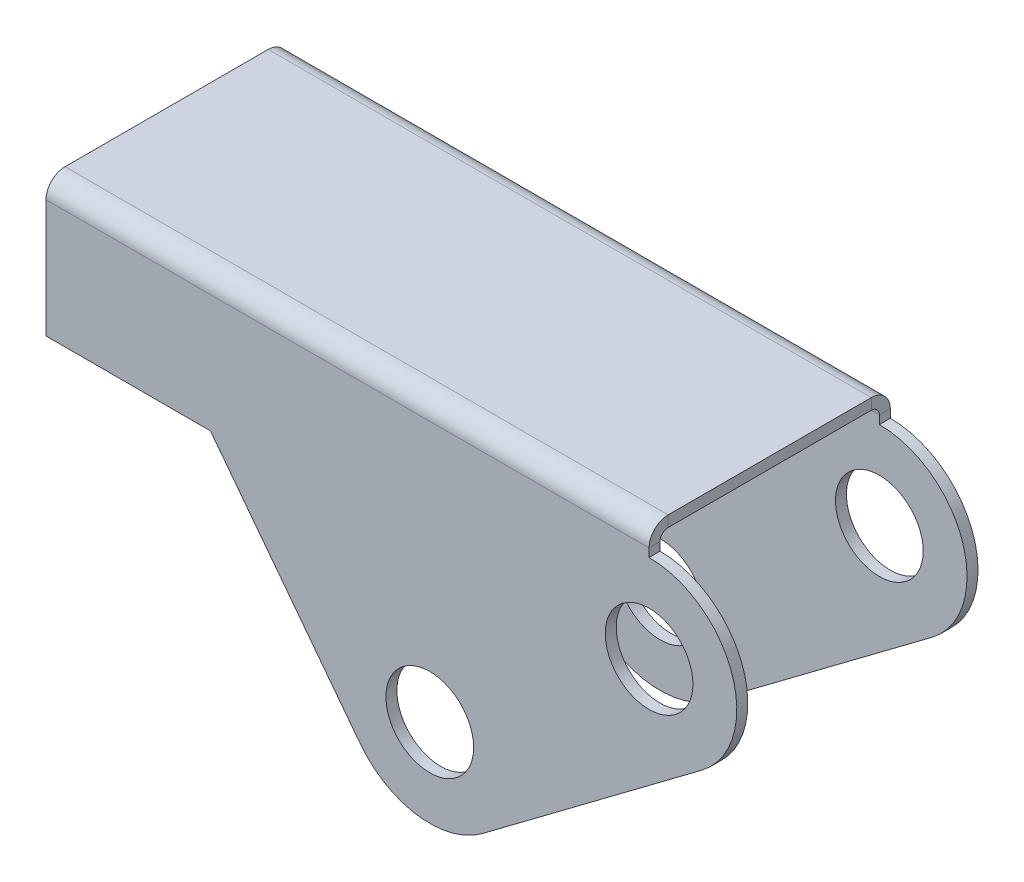
ISO-10303-21;
HEADER;
FILE_DESCRIPTION(('STEP AP214'),'2;1');
FILE_NAME('part.step','',(''),(''),'','','');
FILE_SCHEMA(('AUTOMOTIVE_DESIGN { 1 0 10303 214 1 1 1 1 }'));
ENDSEC;
DATA;
#1=APPLICATION_CONTEXT('core data for automotive mechanical design processes');
#2=APPLICATION_PROTOCOL_DEFINITION('international standard','automotive_design',2000,#1);
#3=PRODUCT_CONTEXT('',#1,'mechanical');
#4=PRODUCT('Part','Part','',(#3));
#5=PRODUCT_RELATED_PRODUCT_CATEGORY('part','',(#4));
#6=PRODUCT_DEFINITION_FORMATION('','',#4);
#7=PRODUCT_DEFINITION_CONTEXT('part definition',#1,'design');
#8=PRODUCT_DEFINITION('design','',#6,#7);
#9=PRODUCT_DEFINITION_SHAPE('','',#8);
#10=(LENGTH_UNIT() NAMED_UNIT(*) SI_UNIT(.MILLI.,.METRE.));
#11=(NAMED_UNIT(*) PLANE_ANGLE_UNIT() SI_UNIT($,.RADIAN.));
#12=(NAMED_UNIT(*) SI_UNIT($,.STERADIAN.) SOLID_ANGLE_UNIT());
#13=UNCERTAINTY_MEASURE_WITH_UNIT(LENGTH_MEASURE(1.E-05),#10,'distance_accuracy_value','');
#14=(GEOMETRIC_REPRESENTATION_CONTEXT(3) GLOBAL_UNCERTAINTY_ASSIGNED_CONTEXT((#13)) GLOBAL_UNIT_ASSIGNED_CONTEXT((#10,
#11,#12)) REPRESENTATION_CONTEXT('',''));
#15=CARTESIAN_POINT('',(0.,0.,0.));
#16=DIRECTION('',(0.,0.,1.));
#17=DIRECTION('',(1.,0.,0.));
#18=AXIS2_PLACEMENT_3D('',#15,#16,#17);
#19=CARTESIAN_POINT('',(20.,25.5,-1.));
#20=DIRECTION('',(1.,0.,0.));
#21=DIRECTION('',(0.,1.,0.));
#22=AXIS2_PLACEMENT_3D('',#19,#20,#21);
#23=PLANE('',#22);
#24=DIRECTION('',(0.,1.,0.));
#25=VECTOR('',#24,1.);
#26=CARTESIAN_POINT('',(20.,25.5,-1.));
#27=LINE('',#26,#25);
#28=CARTESIAN_POINT('',(20.,23.,-1.));
#29=VERTEX_POINT('',#28);
#30=CARTESIAN_POINT('',(20.,23.7634,-1.00000000000001));
#31=VERTEX_POINT('',#30);
#32=EDGE_CURVE('E175',#29,#31,#27,.T.);
#33=ORIENTED_EDGE('',*,*,#32,.T.);
#34=DIRECTION('',(0.,0.,1.));
#35=VECTOR('',#34,1.);
#36=CARTESIAN_POINT('',(20.,23.7634,-1.00000000000001));
#37=LINE('',#36,#35);
#38=CARTESIAN_POINT('',(20.,23.7634,0.));
#39=VERTEX_POINT('',#38);
#40=EDGE_CURVE('E195',#31,#39,#37,.T.);
#41=ORIENTED_EDGE('',*,*,#40,.T.);
#42=DIRECTION('',(0.,1.,0.));
#43=VECTOR('',#42,1.);
#44=CARTESIAN_POINT('',(20.,25.5,0.));
#45=LINE('',#44,#43);
#46=CARTESIAN_POINT('',(20.,23.,0.));
#47=VERTEX_POINT('',#46);
#48=EDGE_CURVE('E158',#47,#39,#45,.T.);
#49=ORIENTED_EDGE('',*,*,#48,.F.);
#50=DIRECTION('',(0.,0.,1.));
#51=VECTOR('',#50,1.);
#52=CARTESIAN_POINT('',(20.,23.,-1.));
#53=LINE('',#52,#51);
#54=EDGE_CURVE('E13',#29,#47,#53,.T.);
#55=ORIENTED_EDGE('',*,*,#54,.F.);
#56=EDGE_LOOP('',(#33,#41,#49,#55));
#57=FACE_BOUND('',#56,.T.);
#58=ADVANCED_FACE('F57',(#57),#23,.T.);
#59=CARTESIAN_POINT('',(20.,15.,-1.));
#60=DIRECTION('',(0.,0.,1.));
#61=DIRECTION('',(1.,0.,0.));
#62=AXIS2_PLACEMENT_3D('',#59,#60,#61);
#63=PLANE('',#62);
#64=CARTESIAN_POINT('',(0.,0.,-1.));
#65=DIRECTION('',(0.,0.,1.));
#66=DIRECTION('',(1.,0.,0.));
#67=AXIS2_PLACEMENT_3D('',#64,#65,#66);
#68=CIRCLE('',#67,4.);
#69=CARTESIAN_POINT('',(4.,0.,-1.));
#70=VERTEX_POINT('',#69);
#71=EDGE_CURVE('E162',#70,#70,#68,.T.);
#72=ORIENTED_EDGE('',*,*,#71,.T.);
#73=EDGE_LOOP('',(#72));
#74=FACE_BOUND('',#73,.T.);
#75=CARTESIAN_POINT('',(20.,15.,-1.));
#76=DIRECTION('',(0.,0.,1.));
#77=DIRECTION('',(1.,0.,0.));
#78=AXIS2_PLACEMENT_3D('',#75,#76,#77);
#79=CIRCLE('',#78,3.99999999999999);
#80=CARTESIAN_POINT('',(24.,15.,-1.));
#81=VERTEX_POINT('',#80);
#82=EDGE_CURVE('E217',#81,#81,#79,.T.);
#83=ORIENTED_EDGE('',*,*,#82,.T.);
#84=EDGE_LOOP('',(#83));
#85=FACE_BOUND('',#84,.T.);
#86=DIRECTION('',(1.,0.,0.));
#87=VECTOR('',#86,1.);
#88=CARTESIAN_POINT('',(20.,23.7634,-1.00000000000001));
#89=LINE('',#88,#87);
#90=CARTESIAN_POINT('',(-35.,23.7634,-0.999999999999997));
#91=VERTEX_POINT('',#90);
#92=EDGE_CURVE('E205',#31,#91,#89,.F.);
#93=ORIENTED_EDGE('',*,*,#92,.F.);
#94=ORIENTED_EDGE('',*,*,#32,.F.);
#95=CARTESIAN_POINT('',(20.,15.,-1.));
#96=DIRECTION('',(0.,0.,1.));
#97=DIRECTION('',(1.,0.,0.));
#98=AXIS2_PLACEMENT_3D('',#95,#96,#97);
#99=CIRCLE('',#98,8.);
#100=CARTESIAN_POINT('',(24.8,8.6,-1.));
#101=VERTEX_POINT('',#100);
#102=EDGE_CURVE('E148',#101,#29,#99,.T.);
#103=ORIENTED_EDGE('',*,*,#102,.F.);
#104=DIRECTION('',(0.8,0.6,0.));
#105=VECTOR('',#104,1.);
#106=CARTESIAN_POINT('',(4.8,-6.4,-1.));
#107=LINE('',#106,#105);
#108=CARTESIAN_POINT('',(4.8,-6.4,-1.));
#109=VERTEX_POINT('',#108);
#110=EDGE_CURVE('E131',#109,#101,#107,.T.);
#111=ORIENTED_EDGE('',*,*,#110,.F.);
#112=CARTESIAN_POINT('',(0.,0.,-1.));
#113=DIRECTION('',(0.,0.,1.));
#114=DIRECTION('',(1.,0.,0.));
#115=AXIS2_PLACEMENT_3D('',#112,#113,#114);
#116=CIRCLE('',#115,8.);
#117=CARTESIAN_POINT('',(-6.35695839304288,-4.85685906621982,-1.));
#118=VERTEX_POINT('',#117);
#119=EDGE_CURVE('E146',#118,#109,#116,.T.);
#120=ORIENTED_EDGE('',*,*,#119,.F.);
#121=DIRECTION('',(0.607107383277477,-0.79461979913036,0.));
#122=VECTOR('',#121,1.);
#123=CARTESIAN_POINT('',(-20.,13.,-1.));
#124=LINE('',#123,#122);
#125=CARTESIAN_POINT('',(-20.,13.,-1.));
#126=VERTEX_POINT('',#125);
#127=EDGE_CURVE('E151',#126,#118,#124,.T.);
#128=ORIENTED_EDGE('',*,*,#127,.F.);
#129=DIRECTION('',(1.,0.,0.));
#130=VECTOR('',#129,1.);
#131=CARTESIAN_POINT('',(-20.,13.,-1.));
#132=LINE('',#131,#130);
#133=CARTESIAN_POINT('',(-35.,13.,-1.));
#134=VERTEX_POINT('',#133);
#135=EDGE_CURVE('E153',#134,#126,#132,.T.);
#136=ORIENTED_EDGE('',*,*,#135,.F.);
#137=DIRECTION('',(0.,-1.,0.));
#138=VECTOR('',#137,1.);
#139=CARTESIAN_POINT('',(-35.,13.,-1.));
#140=LINE('',#139,#138);
#141=EDGE_CURVE('E114',#91,#134,#140,.T.);
#142=ORIENTED_EDGE('',*,*,#141,.F.);
#143=EDGE_LOOP('',(#93,#94,#103,#111,#120,#128,#136,#142));
#144=FACE_BOUND('',#143,.T.);
#145=ADVANCED_FACE('F144',(#74,#85,#144),#63,.F.);
#146=CARTESIAN_POINT('',(20.,15.,0.));
#147=DIRECTION('',(0.,0.,1.));
#148=DIRECTION('',(1.,0.,0.));
#149=AXIS2_PLACEMENT_3D('',#146,#147,#148);
#150=PLANE('',#149);
#151=CARTESIAN_POINT('',(20.,15.,0.));
#152=DIRECTION('',(0.,0.,1.));
#153=DIRECTION('',(1.,0.,0.));
#154=AXIS2_PLACEMENT_3D('',#151,#152,#153);
#155=CIRCLE('',#154,3.99999999999999);
#156=CARTESIAN_POINT('',(24.,15.,0.));
#157=VERTEX_POINT('',#156);
#158=EDGE_CURVE('E214',#157,#157,#155,.T.);
#159=ORIENTED_EDGE('',*,*,#158,.F.);
#160=EDGE_LOOP('',(#159));
#161=FACE_BOUND('',#160,.T.);
#162=CARTESIAN_POINT('',(0.,0.,0.));
#163=DIRECTION('',(0.,0.,1.));
#164=DIRECTION('',(1.,0.,0.));
#165=AXIS2_PLACEMENT_3D('',#162,#163,#164);
#166=CIRCLE('',#165,4.);
#167=CARTESIAN_POINT('',(4.,0.,0.));
#168=VERTEX_POINT('',#167);
#169=EDGE_CURVE('E220',#168,#168,#166,.T.);
#170=ORIENTED_EDGE('',*,*,#169,.F.);
#171=EDGE_LOOP('',(#170));
#172=FACE_BOUND('',#171,.T.);
#173=ORIENTED_EDGE('',*,*,#48,.T.);
#174=DIRECTION('',(1.,0.,0.));
#175=VECTOR('',#174,1.);
#176=CARTESIAN_POINT('',(20.,23.7634,0.));
#177=LINE('',#176,#175);
#178=CARTESIAN_POINT('',(-35.,23.7634,0.));
#179=VERTEX_POINT('',#178);
#180=EDGE_CURVE('E190',#39,#179,#177,.F.);
#181=ORIENTED_EDGE('',*,*,#180,.T.);
#182=DIRECTION('',(0.,-1.,0.));
#183=VECTOR('',#182,1.);
#184=CARTESIAN_POINT('',(-35.,13.,0.));
#185=LINE('',#184,#183);
#186=CARTESIAN_POINT('',(-35.,13.,0.));
#187=VERTEX_POINT('',#186);
#188=EDGE_CURVE('E161',#179,#187,#185,.T.);
#189=ORIENTED_EDGE('',*,*,#188,.T.);
#190=DIRECTION('',(1.,0.,0.));
#191=VECTOR('',#190,1.);
#192=CARTESIAN_POINT('',(-20.,13.,0.));
#193=LINE('',#192,#191);
#194=CARTESIAN_POINT('',(-20.,13.,0.));
#195=VERTEX_POINT('',#194);
#196=EDGE_CURVE('E164',#187,#195,#193,.T.);
#197=ORIENTED_EDGE('',*,*,#196,.T.);
#198=DIRECTION('',(0.607107383277477,-0.79461979913036,0.));
#199=VECTOR('',#198,1.);
#200=CARTESIAN_POINT('',(-20.,13.,0.));
#201=LINE('',#200,#199);
#202=CARTESIAN_POINT('',(-6.35695839304288,-4.85685906621982,0.));
#203=VERTEX_POINT('',#202);
#204=EDGE_CURVE('E167',#195,#203,#201,.T.);
#205=ORIENTED_EDGE('',*,*,#204,.T.);
#206=CARTESIAN_POINT('',(0.,0.,0.));
#207=DIRECTION('',(0.,0.,1.));
#208=DIRECTION('',(1.,0.,0.));
#209=AXIS2_PLACEMENT_3D('',#206,#207,#208);
#210=CIRCLE('',#209,8.);
#211=CARTESIAN_POINT('',(4.8,-6.4,0.));
#212=VERTEX_POINT('',#211);
#213=EDGE_CURVE('E170',#203,#212,#210,.T.);
#214=ORIENTED_EDGE('',*,*,#213,.T.);
#215=DIRECTION('',(0.8,0.6,0.));
#216=VECTOR('',#215,1.);
#217=CARTESIAN_POINT('',(4.8,-6.4,0.));
#218=LINE('',#217,#216);
#219=CARTESIAN_POINT('',(24.8,8.6,0.));
#220=VERTEX_POINT('',#219);
#221=EDGE_CURVE('E134',#212,#220,#218,.T.);
#222=ORIENTED_EDGE('',*,*,#221,.T.);
#223=CARTESIAN_POINT('',(20.,15.,0.));
#224=DIRECTION('',(0.,0.,1.));
#225=DIRECTION('',(1.,0.,0.));
#226=AXIS2_PLACEMENT_3D('',#223,#224,#225);
#227=CIRCLE('',#226,8.);
#228=EDGE_CURVE('E173',#220,#47,#227,.T.);
#229=ORIENTED_EDGE('',*,*,#228,.T.);
#230=EDGE_LOOP('',(#173,#181,#189,#197,#205,#214,#222,#229));
#231=FACE_BOUND('',#230,.T.);
#232=ADVANCED_FACE('F188',(#161,#172,#231),#150,.T.);
#233=CARTESIAN_POINT('',(20.,15.,-1.));
#234=DIRECTION('',(0.,0.,1.));
#235=DIRECTION('',(1.,0.,0.));
#236=AXIS2_PLACEMENT_3D('',#233,#234,#235);
#237=CYLINDRICAL_SURFACE('',#236,8.);
#238=ORIENTED_EDGE('',*,*,#228,.F.);
#239=DIRECTION('',(0.,0.,1.));
#240=VECTOR('',#239,1.);
#241=CARTESIAN_POINT('',(24.8,8.6,-1.));
#242=LINE('',#241,#240);
#243=EDGE_CURVE('E65',#101,#220,#242,.T.);
#244=ORIENTED_EDGE('',*,*,#243,.F.);
#245=ORIENTED_EDGE('',*,*,#102,.T.);
#246=ORIENTED_EDGE('',*,*,#54,.T.);
#247=EDGE_LOOP('',(#238,#244,#245,#246));
#248=FACE_BOUND('',#247,.T.);
#249=ADVANCED_FACE('F231',(#248),#237,.T.);
#250=CARTESIAN_POINT('',(4.8,-6.4,-1.));
#251=DIRECTION('',(0.6,-0.8,0.));
#252=DIRECTION('',(0.8,0.6,0.));
#253=AXIS2_PLACEMENT_3D('',#250,#251,#252);
#254=PLANE('',#253);
#255=ORIENTED_EDGE('',*,*,#221,.F.);
#256=DIRECTION('',(0.,0.,1.));
#257=VECTOR('',#256,1.);
#258=CARTESIAN_POINT('',(4.8,-6.4,-1.));
#259=LINE('',#258,#257);
#260=EDGE_CURVE('E128',#109,#212,#259,.T.);
#261=ORIENTED_EDGE('',*,*,#260,.F.);
#262=ORIENTED_EDGE('',*,*,#110,.T.);
#263=ORIENTED_EDGE('',*,*,#243,.T.);
#264=EDGE_LOOP('',(#255,#261,#262,#263));
#265=FACE_BOUND('',#264,.T.);
#266=ADVANCED_FACE('F130',(#265),#254,.T.);
#267=CARTESIAN_POINT('',(0.,0.,-1.));
#268=DIRECTION('',(0.,0.,1.));
#269=DIRECTION('',(1.,0.,0.));
#270=AXIS2_PLACEMENT_3D('',#267,#268,#269);
#271=CYLINDRICAL_SURFACE('',#270,8.);
#272=ORIENTED_EDGE('',*,*,#213,.F.);
#273=DIRECTION('',(0.,0.,1.));
#274=VECTOR('',#273,1.);
#275=CARTESIAN_POINT('',(-6.35695839304288,-4.85685906621982,-1.));
#276=LINE('',#275,#274);
#277=EDGE_CURVE('E139',#118,#203,#276,.T.);
#278=ORIENTED_EDGE('',*,*,#277,.F.);
#279=ORIENTED_EDGE('',*,*,#119,.T.);
#280=ORIENTED_EDGE('',*,*,#260,.T.);
#281=EDGE_LOOP('',(#272,#278,#279,#280));
#282=FACE_BOUND('',#281,.T.);
#283=ADVANCED_FACE('F150',(#282),#271,.T.);
#284=CARTESIAN_POINT('',(-20.,13.,-1.));
#285=DIRECTION('',(-0.79461979913036,-0.607107383277478,0.));
#286=DIRECTION('',(0.607107383277477,-0.79461979913036,0.));
#287=AXIS2_PLACEMENT_3D('',#284,#285,#286);
#288=PLANE('',#287);
#289=ORIENTED_EDGE('',*,*,#204,.F.);
#290=DIRECTION('',(0.,0.,1.));
#291=VECTOR('',#290,1.);
#292=CARTESIAN_POINT('',(-20.,13.,-1.));
#293=LINE('',#292,#291);
#294=EDGE_CURVE('E178',#126,#195,#293,.T.);
#295=ORIENTED_EDGE('',*,*,#294,.F.);
#296=ORIENTED_EDGE('',*,*,#127,.T.);
#297=ORIENTED_EDGE('',*,*,#277,.T.);
#298=EDGE_LOOP('',(#289,#295,#296,#297));
#299=FACE_BOUND('',#298,.T.);
#300=ADVANCED_FACE('F230',(#299),#288,.T.);
#301=CARTESIAN_POINT('',(-20.,13.,-1.));
#302=DIRECTION('',(0.,-1.,0.));
#303=DIRECTION('',(0.,0.,-1.));
#304=AXIS2_PLACEMENT_3D('',#301,#302,#303);
#305=PLANE('',#304);
#306=ORIENTED_EDGE('',*,*,#196,.F.);
#307=DIRECTION('',(0.,0.,1.));
#308=VECTOR('',#307,1.);
#309=CARTESIAN_POINT('',(-35.,13.,-1.));
#310=LINE('',#309,#308);
#311=EDGE_CURVE('E60',#134,#187,#310,.T.);
#312=ORIENTED_EDGE('',*,*,#311,.F.);
#313=ORIENTED_EDGE('',*,*,#135,.T.);
#314=ORIENTED_EDGE('',*,*,#294,.T.);
#315=EDGE_LOOP('',(#306,#312,#313,#314));
#316=FACE_BOUND('',#315,.T.);
#317=ADVANCED_FACE('F186',(#316),#305,.T.);
#318=CARTESIAN_POINT('',(-35.,13.,-1.));
#319=DIRECTION('',(-1.,0.,0.));
#320=DIRECTION('',(0.,0.,1.));
#321=AXIS2_PLACEMENT_3D('',#318,#319,#320);
#322=PLANE('',#321);
#323=DIRECTION('',(0.,0.,1.));
#324=VECTOR('',#323,1.);
#325=CARTESIAN_POINT('',(-35.,23.7634,-0.999999999999997));
#326=LINE('',#325,#324);
#327=EDGE_CURVE('E212',#91,#179,#326,.T.);
#328=ORIENTED_EDGE('',*,*,#327,.F.);
#329=ORIENTED_EDGE('',*,*,#141,.T.);
#330=ORIENTED_EDGE('',*,*,#311,.T.);
#331=ORIENTED_EDGE('',*,*,#188,.F.);
#332=EDGE_LOOP('',(#328,#329,#330,#331));
#333=FACE_BOUND('',#332,.T.);
#334=ADVANCED_FACE('F184',(#333),#322,.T.);
#335=CARTESIAN_POINT('',(0.,0.,-1.));
#336=DIRECTION('',(0.,0.,1.));
#337=DIRECTION('',(1.,0.,0.));
#338=AXIS2_PLACEMENT_3D('',#335,#336,#337);
#339=CYLINDRICAL_SURFACE('',#338,4.);
#340=ORIENTED_EDGE('',*,*,#71,.F.);
#341=EDGE_LOOP('',(#340));
#342=FACE_BOUND('',#341,.T.);
#343=ORIENTED_EDGE('',*,*,#169,.T.);
#344=EDGE_LOOP('',(#343));
#345=FACE_BOUND('',#344,.T.);
#346=ADVANCED_FACE('F524',(#342,#345),#339,.F.);
#347=CARTESIAN_POINT('',(20.,15.,-1.));
#348=DIRECTION('',(0.,0.,1.));
#349=DIRECTION('',(1.,0.,0.));
#350=AXIS2_PLACEMENT_3D('',#347,#348,#349);
#351=CYLINDRICAL_SURFACE('',#350,3.99999999999999);
#352=ORIENTED_EDGE('',*,*,#82,.F.);
#353=EDGE_LOOP('',(#352));
#354=FACE_BOUND('',#353,.T.);
#355=ORIENTED_EDGE('',*,*,#158,.T.);
#356=EDGE_LOOP('',(#355));
#357=FACE_BOUND('',#356,.T.);
#358=ADVANCED_FACE('F519',(#354,#357),#351,.F.);
#359=CARTESIAN_POINT('',(-35.,23.7634,-1.7366));
#360=DIRECTION('',(-1.,0.,0.));
#361=DIRECTION('',(0.,0.,1.));
#362=AXIS2_PLACEMENT_3D('',#359,#360,#361);
#363=PLANE('',#362);
#364=DIRECTION('',(0.,-1.,0.));
#365=VECTOR('',#364,1.);
#366=CARTESIAN_POINT('',(-35.,25.5,-1.73659999999999));
#367=LINE('',#366,#365);
#368=CARTESIAN_POINT('',(-35.,24.5,-1.7366));
#369=VERTEX_POINT('',#368);
#370=CARTESIAN_POINT('',(-35.,25.5,-1.73659999999999));
#371=VERTEX_POINT('',#370);
#372=EDGE_CURVE('E200',#369,#371,#367,.F.);
#373=ORIENTED_EDGE('',*,*,#372,.F.);
#374=CARTESIAN_POINT('',(-35.,23.7634,-1.7366));
#375=DIRECTION('',(1.,0.,0.));
#376=DIRECTION('',(0.,0.,-1.));
#377=AXIS2_PLACEMENT_3D('',#374,#375,#376);
#378=CIRCLE('',#377,0.7366);
#379=EDGE_CURVE('E197',#91,#369,#378,.F.);
#380=ORIENTED_EDGE('',*,*,#379,.F.);
#381=ORIENTED_EDGE('',*,*,#327,.T.);
#382=CARTESIAN_POINT('',(-35.,23.7634,-1.7366));
#383=DIRECTION('',(1.,0.,0.));
#384=DIRECTION('',(0.,0.,-1.));
#385=AXIS2_PLACEMENT_3D('',#382,#383,#384);
#386=CIRCLE('',#385,1.7366);
#387=EDGE_CURVE('E73',#179,#371,#386,.F.);
#388=ORIENTED_EDGE('',*,*,#387,.T.);
#389=EDGE_LOOP('',(#373,#380,#381,#388));
#390=FACE_BOUND('',#389,.T.);
#391=ADVANCED_FACE('F261',(#390),#363,.T.);
#392=CARTESIAN_POINT('',(20.,23.7634,-1.73660000000001));
#393=DIRECTION('',(-1.,0.,0.));
#394=DIRECTION('',(0.,0.,1.));
#395=AXIS2_PLACEMENT_3D('',#392,#393,#394);
#396=PLANE('',#395);
#397=CARTESIAN_POINT('',(20.,23.7634,-1.73660000000001));
#398=DIRECTION('',(1.,0.,0.));
#399=DIRECTION('',(0.,0.,-1.));
#400=AXIS2_PLACEMENT_3D('',#397,#398,#399);
#401=CIRCLE('',#400,0.7366);
#402=CARTESIAN_POINT('',(20.,24.5,-1.7366));
#403=VERTEX_POINT('',#402);
#404=EDGE_CURVE('E208',#403,#31,#401,.T.);
#405=ORIENTED_EDGE('',*,*,#404,.F.);
#406=DIRECTION('',(0.,-1.,0.));
#407=VECTOR('',#406,1.);
#408=CARTESIAN_POINT('',(20.,24.5,-1.7366));
#409=LINE('',#408,#407);
#410=CARTESIAN_POINT('',(20.,25.5,-1.7366));
#411=VERTEX_POINT('',#410);
#412=EDGE_CURVE('E270',#403,#411,#409,.F.);
#413=ORIENTED_EDGE('',*,*,#412,.T.);
#414=CARTESIAN_POINT('',(20.,23.7634,-1.73660000000001));
#415=DIRECTION('',(1.,0.,0.));
#416=DIRECTION('',(0.,0.,-1.));
#417=AXIS2_PLACEMENT_3D('',#414,#415,#416);
#418=CIRCLE('',#417,1.7366);
#419=EDGE_CURVE('E193',#411,#39,#418,.T.);
#420=ORIENTED_EDGE('',*,*,#419,.T.);
#421=ORIENTED_EDGE('',*,*,#40,.F.);
#422=EDGE_LOOP('',(#405,#413,#420,#421));
#423=FACE_BOUND('',#422,.T.);
#424=ADVANCED_FACE('F313',(#423),#396,.F.);
#425=CARTESIAN_POINT('',(20.,23.7634,-1.73660000000001));
#426=DIRECTION('',(1.,0.,0.));
#427=DIRECTION('',(0.,1.,0.));
#428=AXIS2_PLACEMENT_3D('',#425,#426,#427);
#429=CYLINDRICAL_SURFACE('',#428,1.7366);
#430=ORIENTED_EDGE('',*,*,#180,.F.);
#431=ORIENTED_EDGE('',*,*,#419,.F.);
#432=DIRECTION('',(1.,0.,0.));
#433=VECTOR('',#432,1.);
#434=CARTESIAN_POINT('',(-35.,25.5,-1.73659999999999));
#435=LINE('',#434,#433);
#436=EDGE_CURVE('E307',#411,#371,#435,.F.);
#437=ORIENTED_EDGE('',*,*,#436,.T.);
#438=ORIENTED_EDGE('',*,*,#387,.F.);
#439=EDGE_LOOP('',(#430,#431,#437,#438));
#440=FACE_BOUND('',#439,.T.);
#441=ADVANCED_FACE('F512',(#440),#429,.T.);
#442=CARTESIAN_POINT('',(20.,23.7634,-1.73660000000001));
#443=DIRECTION('',(1.,0.,0.));
#444=DIRECTION('',(0.,1.,0.));
#445=AXIS2_PLACEMENT_3D('',#442,#443,#444);
#446=CYLINDRICAL_SURFACE('',#445,0.7366);
#447=ORIENTED_EDGE('',*,*,#92,.T.);
#448=ORIENTED_EDGE('',*,*,#379,.T.);
#449=DIRECTION('',(1.,0.,0.));
#450=VECTOR('',#449,1.);
#451=CARTESIAN_POINT('',(-35.,24.5,-1.7366));
#452=LINE('',#451,#450);
#453=EDGE_CURVE('E268',#369,#403,#452,.T.);
#454=ORIENTED_EDGE('',*,*,#453,.T.);
#455=ORIENTED_EDGE('',*,*,#404,.T.);
#456=EDGE_LOOP('',(#447,#448,#454,#455));
#457=FACE_BOUND('',#456,.T.);
#458=ADVANCED_FACE('F252',(#457),#446,.F.);
#459=CARTESIAN_POINT('',(20.,25.5,-11.));
#460=DIRECTION('',(-1.,0.,0.));
#461=DIRECTION('',(0.,-1.,0.));
#462=AXIS2_PLACEMENT_3D('',#459,#460,#461);
#463=PLANE('',#462);
#464=ORIENTED_EDGE('',*,*,#412,.F.);
#465=DIRECTION('',(0.,0.,1.));
#466=VECTOR('',#465,1.);
#467=CARTESIAN_POINT('',(20.,24.5,-11.));
#468=LINE('',#467,#466);
#469=CARTESIAN_POINT('',(20.,24.5000000000001,-20.2634));
#470=VERTEX_POINT('',#469);
#471=EDGE_CURVE('E304',#403,#470,#468,.F.);
#472=ORIENTED_EDGE('',*,*,#471,.T.);
#473=DIRECTION('',(0.,-1.,0.));
#474=VECTOR('',#473,1.);
#475=CARTESIAN_POINT('',(20.,24.5000000000001,-20.2634));
#476=LINE('',#475,#474);
#477=CARTESIAN_POINT('',(20.,25.5000000000001,-20.2634));
#478=VERTEX_POINT('',#477);
#479=EDGE_CURVE('E327',#470,#478,#476,.F.);
#480=ORIENTED_EDGE('',*,*,#479,.T.);
#481=DIRECTION('',(0.,0.,-1.));
#482=VECTOR('',#481,1.);
#483=CARTESIAN_POINT('',(20.,25.5,0.));
#484=LINE('',#483,#482);
#485=EDGE_CURVE('E299',#411,#478,#484,.T.);
#486=ORIENTED_EDGE('',*,*,#485,.F.);
#487=EDGE_LOOP('',(#464,#472,#480,#486));
#488=FACE_BOUND('',#487,.T.);
#489=ADVANCED_FACE('F325',(#488),#463,.F.);
#490=CARTESIAN_POINT('',(-35.,25.5,-0.999999999999997));
#491=DIRECTION('',(1.,0.,0.));
#492=DIRECTION('',(0.,1.,0.));
#493=AXIS2_PLACEMENT_3D('',#490,#491,#492);
#494=PLANE('',#493);
#495=ORIENTED_EDGE('',*,*,#372,.T.);
#496=DIRECTION('',(0.,0.,1.));
#497=VECTOR('',#496,1.);
#498=CARTESIAN_POINT('',(-35.,25.5,0.));
#499=LINE('',#498,#497);
#500=CARTESIAN_POINT('',(-35.,25.5000000000001,-20.2634));
#501=VERTEX_POINT('',#500);
#502=EDGE_CURVE('E211',#501,#371,#499,.T.);
#503=ORIENTED_EDGE('',*,*,#502,.F.);
#504=DIRECTION('',(0.,-1.,0.));
#505=VECTOR('',#504,1.);
#506=CARTESIAN_POINT('',(-35.,25.5000000000001,-20.2634));
#507=LINE('',#506,#505);
#508=CARTESIAN_POINT('',(-35.,24.5000000000001,-20.2634));
#509=VERTEX_POINT('',#508);
#510=EDGE_CURVE('E476',#509,#501,#507,.F.);
#511=ORIENTED_EDGE('',*,*,#510,.F.);
#512=DIRECTION('',(0.,0.,-1.));
#513=VECTOR('',#512,1.);
#514=CARTESIAN_POINT('',(-35.,24.5,-1.));
#515=LINE('',#514,#513);
#516=EDGE_CURVE('E302',#509,#369,#515,.F.);
#517=ORIENTED_EDGE('',*,*,#516,.T.);
#518=EDGE_LOOP('',(#495,#503,#511,#517));
#519=FACE_BOUND('',#518,.T.);
#520=ADVANCED_FACE('F493',(#519),#494,.F.);
#521=CARTESIAN_POINT('',(0.,25.5,0.));
#522=DIRECTION('',(0.,-1.,0.));
#523=DIRECTION('',(0.,0.,-1.));
#524=AXIS2_PLACEMENT_3D('',#521,#522,#523);
#525=PLANE('',#524);
#526=ORIENTED_EDGE('',*,*,#436,.F.);
#527=ORIENTED_EDGE('',*,*,#485,.T.);
#528=DIRECTION('',(1.,0.,0.));
#529=VECTOR('',#528,1.);
#530=CARTESIAN_POINT('',(-35.,25.5000000000001,-20.2634));
#531=LINE('',#530,#529);
#532=EDGE_CURVE('E336',#478,#501,#531,.F.);
#533=ORIENTED_EDGE('',*,*,#532,.T.);
#534=ORIENTED_EDGE('',*,*,#502,.T.);
#535=EDGE_LOOP('',(#526,#527,#533,#534));
#536=FACE_BOUND('',#535,.T.);
#537=ADVANCED_FACE('F320',(#536),#525,.F.);
#538=CARTESIAN_POINT('',(0.,24.5,0.));
#539=DIRECTION('',(0.,-1.,0.));
#540=DIRECTION('',(0.,0.,-1.));
#541=AXIS2_PLACEMENT_3D('',#538,#539,#540);
#542=PLANE('',#541);
#543=ORIENTED_EDGE('',*,*,#471,.F.);
#544=ORIENTED_EDGE('',*,*,#453,.F.);
#545=ORIENTED_EDGE('',*,*,#516,.F.);
#546=DIRECTION('',(1.,0.,0.));
#547=VECTOR('',#546,1.);
#548=CARTESIAN_POINT('',(-35.,24.5000000000001,-20.2634));
#549=LINE('',#548,#547);
#550=EDGE_CURVE('E337',#509,#470,#549,.T.);
#551=ORIENTED_EDGE('',*,*,#550,.T.);
#552=EDGE_LOOP('',(#543,#544,#545,#551));
#553=FACE_BOUND('',#552,.T.);
#554=ADVANCED_FACE('F498',(#553),#542,.T.);
#555=CARTESIAN_POINT('',(20.,25.5000000000001,-21.));
#556=DIRECTION('',(1.,0.,0.));
#557=DIRECTION('',(0.,1.,0.));
#558=AXIS2_PLACEMENT_3D('',#555,#556,#557);
#559=PLANE('',#558);
#560=DIRECTION('',(0.,1.,0.));
#561=VECTOR('',#560,1.);
#562=CARTESIAN_POINT('',(20.,25.5000000000001,-21.));
#563=LINE('',#562,#561);
#564=CARTESIAN_POINT('',(20.,23.0000000000001,-21.));
#565=VERTEX_POINT('',#564);
#566=CARTESIAN_POINT('',(20.,23.7634000000001,-21.));
#567=VERTEX_POINT('',#566);
#568=EDGE_CURVE('E380',#565,#567,#563,.T.);
#569=ORIENTED_EDGE('',*,*,#568,.F.);
#570=DIRECTION('',(0.,0.,-1.));
#571=VECTOR('',#570,1.);
#572=CARTESIAN_POINT('',(20.,23.0000000000001,-21.));
#573=LINE('',#572,#571);
#574=CARTESIAN_POINT('',(20.,23.0000000000001,-22.));
#575=VERTEX_POINT('',#574);
#576=EDGE_CURVE('E269',#565,#575,#573,.T.);
#577=ORIENTED_EDGE('',*,*,#576,.T.);
#578=DIRECTION('',(0.,1.,0.));
#579=VECTOR('',#578,1.);
#580=CARTESIAN_POINT('',(20.,25.5000000000001,-22.));
#581=LINE('',#580,#579);
#582=CARTESIAN_POINT('',(20.,23.7634000000001,-22.));
#583=VERTEX_POINT('',#582);
#584=EDGE_CURVE('E377',#575,#583,#581,.T.);
#585=ORIENTED_EDGE('',*,*,#584,.T.);
#586=DIRECTION('',(0.,0.,-1.));
#587=VECTOR('',#586,1.);
#588=CARTESIAN_POINT('',(20.,23.7634000000001,-21.));
#589=LINE('',#588,#587);
#590=EDGE_CURVE('E345',#567,#583,#589,.T.);
#591=ORIENTED_EDGE('',*,*,#590,.F.);
#592=EDGE_LOOP('',(#569,#577,#585,#591));
#593=FACE_BOUND('',#592,.T.);
#594=ADVANCED_FACE('F430',(#593),#559,.T.);
#595=CARTESIAN_POINT('',(20.,15.0000000000001,-21.0000000000001));
#596=DIRECTION('',(0.,0.,-1.));
#597=DIRECTION('',(1.,0.,0.));
#598=AXIS2_PLACEMENT_3D('',#595,#596,#597);
#599=PLANE('',#598);
#600=CARTESIAN_POINT('',(0.,0.,-21.0000000000002));
#601=DIRECTION('',(0.,0.,1.));
#602=DIRECTION('',(1.,0.,0.));
#603=AXIS2_PLACEMENT_3D('',#600,#601,#602);
#604=CIRCLE('',#603,4.);
#605=CARTESIAN_POINT('',(4.,0.,-21.0000000000002));
#606=VERTEX_POINT('',#605);
#607=EDGE_CURVE('E374',#606,#606,#604,.T.);
#608=ORIENTED_EDGE('',*,*,#607,.F.);
#609=EDGE_LOOP('',(#608));
#610=FACE_BOUND('',#609,.T.);
#611=CARTESIAN_POINT('',(20.,15.0000000000001,-21.0000000000001));
#612=DIRECTION('',(0.,0.,1.));
#613=DIRECTION('',(1.,0.,0.));
#614=AXIS2_PLACEMENT_3D('',#611,#612,#613);
#615=CIRCLE('',#614,3.99999999999999);
#616=CARTESIAN_POINT('',(24.,15.0000000000001,-21.0000000000001));
#617=VERTEX_POINT('',#616);
#618=EDGE_CURVE('E368',#617,#617,#615,.T.);
#619=ORIENTED_EDGE('',*,*,#618,.F.);
#620=EDGE_LOOP('',(#619));
#621=FACE_BOUND('',#620,.T.);
#622=DIRECTION('',(1.,0.,0.));
#623=VECTOR('',#622,1.);
#624=CARTESIAN_POINT('',(20.,23.7634000000001,-21.));
#625=LINE('',#624,#623);
#626=CARTESIAN_POINT('',(-35.,23.7634000000001,-21.));
#627=VERTEX_POINT('',#626);
#628=EDGE_CURVE('E355',#567,#627,#625,.F.);
#629=ORIENTED_EDGE('',*,*,#628,.T.);
#630=DIRECTION('',(0.,-1.,0.));
#631=VECTOR('',#630,1.);
#632=CARTESIAN_POINT('',(-35.,13.0000000000001,-21.0000000000001));
#633=LINE('',#632,#631);
#634=CARTESIAN_POINT('',(-35.,13.0000000000001,-21.0000000000001));
#635=VERTEX_POINT('',#634);
#636=EDGE_CURVE('E383',#627,#635,#633,.T.);
#637=ORIENTED_EDGE('',*,*,#636,.T.);
#638=DIRECTION('',(1.,0.,0.));
#639=VECTOR('',#638,1.);
#640=CARTESIAN_POINT('',(-20.,13.0000000000001,-21.0000000000001));
#641=LINE('',#640,#639);
#642=CARTESIAN_POINT('',(-20.,13.0000000000001,-21.0000000000001));
#643=VERTEX_POINT('',#642);
#644=EDGE_CURVE('E386',#635,#643,#641,.T.);
#645=ORIENTED_EDGE('',*,*,#644,.T.);
#646=DIRECTION('',(0.607107383277477,-0.79461979913036,0.));
#647=VECTOR('',#646,1.);
#648=CARTESIAN_POINT('',(-20.,13.0000000000001,-21.0000000000001));
#649=LINE('',#648,#647);
#650=CARTESIAN_POINT('',(-6.35695839304288,-4.85685906621975,-21.0000000000002));
#651=VERTEX_POINT('',#650);
#652=EDGE_CURVE('E389',#643,#651,#649,.T.);
#653=ORIENTED_EDGE('',*,*,#652,.T.);
#654=CARTESIAN_POINT('',(0.,0.,-21.0000000000002));
#655=DIRECTION('',(0.,0.,1.));
#656=DIRECTION('',(1.,0.,0.));
#657=AXIS2_PLACEMENT_3D('',#654,#655,#656);
#658=CIRCLE('',#657,8.);
#659=CARTESIAN_POINT('',(4.8,-6.39999999999993,-21.0000000000002));
#660=VERTEX_POINT('',#659);
#661=EDGE_CURVE('E392',#651,#660,#658,.T.);
#662=ORIENTED_EDGE('',*,*,#661,.T.);
#663=DIRECTION('',(0.8,0.6,0.));
#664=VECTOR('',#663,1.);
#665=CARTESIAN_POINT('',(4.8,-6.39999999999993,-21.0000000000002));
#666=LINE('',#665,#664);
#667=CARTESIAN_POINT('',(24.8,8.60000000000007,-21.0000000000001));
#668=VERTEX_POINT('',#667);
#669=EDGE_CURVE('E395',#660,#668,#666,.T.);
#670=ORIENTED_EDGE('',*,*,#669,.T.);
#671=CARTESIAN_POINT('',(20.,15.0000000000001,-21.0000000000001));
#672=DIRECTION('',(0.,0.,1.));
#673=DIRECTION('',(1.,0.,0.));
#674=AXIS2_PLACEMENT_3D('',#671,#672,#673);
#675=CIRCLE('',#674,8.);
#676=EDGE_CURVE('E297',#668,#565,#675,.T.);
#677=ORIENTED_EDGE('',*,*,#676,.T.);
#678=ORIENTED_EDGE('',*,*,#568,.T.);
#679=EDGE_LOOP('',(#629,#637,#645,#653,#662,#670,#677,#678));
#680=FACE_BOUND('',#679,.T.);
#681=ADVANCED_FACE('F488',(#610,#621,#680),#599,.F.);
#682=CARTESIAN_POINT('',(20.,15.0000000000001,-22.0000000000001));
#683=DIRECTION('',(0.,0.,-1.));
#684=DIRECTION('',(1.,0.,0.));
#685=AXIS2_PLACEMENT_3D('',#682,#683,#684);
#686=PLANE('',#685);
#687=CARTESIAN_POINT('',(20.,15.0000000000001,-22.0000000000001));
#688=DIRECTION('',(0.,0.,1.));
#689=DIRECTION('',(1.,0.,0.));
#690=AXIS2_PLACEMENT_3D('',#687,#688,#689);
#691=CIRCLE('',#690,3.99999999999999);
#692=CARTESIAN_POINT('',(24.,15.0000000000001,-22.0000000000001));
#693=VERTEX_POINT('',#692);
#694=EDGE_CURVE('E366',#693,#693,#691,.T.);
#695=ORIENTED_EDGE('',*,*,#694,.T.);
#696=EDGE_LOOP('',(#695));
#697=FACE_BOUND('',#696,.T.);
#698=CARTESIAN_POINT('',(0.,0.,-22.0000000000002));
#699=DIRECTION('',(0.,0.,1.));
#700=DIRECTION('',(1.,0.,0.));
#701=AXIS2_PLACEMENT_3D('',#698,#699,#700);
#702=CIRCLE('',#701,4.);
#703=CARTESIAN_POINT('',(4.,0.,-22.0000000000002));
#704=VERTEX_POINT('',#703);
#705=EDGE_CURVE('E371',#704,#704,#702,.T.);
#706=ORIENTED_EDGE('',*,*,#705,.T.);
#707=EDGE_LOOP('',(#706));
#708=FACE_BOUND('',#707,.T.);
#709=ORIENTED_EDGE('',*,*,#584,.F.);
#710=CARTESIAN_POINT('',(20.,15.0000000000001,-22.0000000000001));
#711=DIRECTION('',(0.,0.,1.));
#712=DIRECTION('',(1.,0.,0.));
#713=AXIS2_PLACEMENT_3D('',#710,#711,#712);
#714=CIRCLE('',#713,8.);
#715=CARTESIAN_POINT('',(24.8,8.60000000000008,-22.0000000000001));
#716=VERTEX_POINT('',#715);
#717=EDGE_CURVE('E283',#716,#575,#714,.T.);
#718=ORIENTED_EDGE('',*,*,#717,.F.);
#719=DIRECTION('',(0.8,0.6,0.));
#720=VECTOR('',#719,1.);
#721=CARTESIAN_POINT('',(4.8,-6.39999999999992,-22.0000000000002));
#722=LINE('',#721,#720);
#723=CARTESIAN_POINT('',(4.8,-6.39999999999993,-22.0000000000002));
#724=VERTEX_POINT('',#723);
#725=EDGE_CURVE('E412',#724,#716,#722,.T.);
#726=ORIENTED_EDGE('',*,*,#725,.F.);
#727=CARTESIAN_POINT('',(0.,0.,-22.0000000000002));
#728=DIRECTION('',(0.,0.,1.));
#729=DIRECTION('',(1.,0.,0.));
#730=AXIS2_PLACEMENT_3D('',#727,#728,#729);
#731=CIRCLE('',#730,8.);
#732=CARTESIAN_POINT('',(-6.35695839304288,-4.85685906621974,-22.0000000000002));
#733=VERTEX_POINT('',#732);
#734=EDGE_CURVE('E410',#733,#724,#731,.T.);
#735=ORIENTED_EDGE('',*,*,#734,.F.);
#736=DIRECTION('',(0.607107383277477,-0.79461979913036,0.));
#737=VECTOR('',#736,1.);
#738=CARTESIAN_POINT('',(-20.,13.0000000000001,-22.0000000000001));
#739=LINE('',#738,#737);
#740=CARTESIAN_POINT('',(-20.,13.0000000000001,-22.0000000000001));
#741=VERTEX_POINT('',#740);
#742=EDGE_CURVE('E407',#741,#733,#739,.T.);
#743=ORIENTED_EDGE('',*,*,#742,.F.);
#744=DIRECTION('',(1.,0.,0.));
#745=VECTOR('',#744,1.);
#746=CARTESIAN_POINT('',(-20.,13.0000000000001,-22.0000000000001));
#747=LINE('',#746,#745);
#748=CARTESIAN_POINT('',(-35.,13.0000000000001,-22.0000000000001));
#749=VERTEX_POINT('',#748);
#750=EDGE_CURVE('E404',#749,#741,#747,.T.);
#751=ORIENTED_EDGE('',*,*,#750,.F.);
#752=DIRECTION('',(0.,-1.,0.));
#753=VECTOR('',#752,1.);
#754=CARTESIAN_POINT('',(-35.,13.0000000000001,-22.0000000000001));
#755=LINE('',#754,#753);
#756=CARTESIAN_POINT('',(-35.,23.7634000000001,-22.));
#757=VERTEX_POINT('',#756);
#758=EDGE_CURVE('E401',#757,#749,#755,.T.);
#759=ORIENTED_EDGE('',*,*,#758,.F.);
#760=DIRECTION('',(1.,0.,0.));
#761=VECTOR('',#760,1.);
#762=CARTESIAN_POINT('',(20.,23.7634000000001,-22.));
#763=LINE('',#762,#761);
#764=EDGE_CURVE('E349',#583,#757,#763,.F.);
#765=ORIENTED_EDGE('',*,*,#764,.F.);
#766=EDGE_LOOP('',(#709,#718,#726,#735,#743,#751,#759,#765));
#767=FACE_BOUND('',#766,.T.);
#768=ADVANCED_FACE('F428',(#697,#708,#767),#686,.T.);
#769=CARTESIAN_POINT('',(20.,15.0000000000001,-21.0000000000001));
#770=DIRECTION('',(0.,0.,-1.));
#771=DIRECTION('',(1.,0.,0.));
#772=AXIS2_PLACEMENT_3D('',#769,#770,#771);
#773=CYLINDRICAL_SURFACE('',#772,8.);
#774=ORIENTED_EDGE('',*,*,#717,.T.);
#775=ORIENTED_EDGE('',*,*,#576,.F.);
#776=ORIENTED_EDGE('',*,*,#676,.F.);
#777=DIRECTION('',(0.,0.,-1.));
#778=VECTOR('',#777,1.);
#779=CARTESIAN_POINT('',(24.8,8.60000000000007,-21.0000000000001));
#780=LINE('',#779,#778);
#781=EDGE_CURVE('E272',#668,#716,#780,.T.);
#782=ORIENTED_EDGE('',*,*,#781,.T.);
#783=EDGE_LOOP('',(#774,#775,#776,#782));
#784=FACE_BOUND('',#783,.T.);
#785=ADVANCED_FACE('F422',(#784),#773,.T.);
#786=CARTESIAN_POINT('',(4.8,-6.39999999999993,-21.0000000000002));
#787=DIRECTION('',(0.6,-0.8,0.));
#788=DIRECTION('',(0.8,0.6,0.));
#789=AXIS2_PLACEMENT_3D('',#786,#787,#788);
#790=PLANE('',#789);
#791=ORIENTED_EDGE('',*,*,#725,.T.);
#792=ORIENTED_EDGE('',*,*,#781,.F.);
#793=ORIENTED_EDGE('',*,*,#669,.F.);
#794=DIRECTION('',(0.,0.,-1.));
#795=VECTOR('',#794,1.);
#796=CARTESIAN_POINT('',(4.8,-6.39999999999993,-21.0000000000002));
#797=LINE('',#796,#795);
#798=EDGE_CURVE('E280',#660,#724,#797,.T.);
#799=ORIENTED_EDGE('',*,*,#798,.T.);
#800=EDGE_LOOP('',(#791,#792,#793,#799));
#801=FACE_BOUND('',#800,.T.);
#802=ADVANCED_FACE('F719',(#801),#790,.T.);
#803=CARTESIAN_POINT('',(0.,0.,-21.0000000000002));
#804=DIRECTION('',(0.,0.,-1.));
#805=DIRECTION('',(1.,0.,0.));
#806=AXIS2_PLACEMENT_3D('',#803,#804,#805);
#807=CYLINDRICAL_SURFACE('',#806,8.);
#808=ORIENTED_EDGE('',*,*,#734,.T.);
#809=ORIENTED_EDGE('',*,*,#798,.F.);
#810=ORIENTED_EDGE('',*,*,#661,.F.);
#811=DIRECTION('',(0.,0.,-1.));
#812=VECTOR('',#811,1.);
#813=CARTESIAN_POINT('',(-6.35695839304288,-4.85685906621975,-21.0000000000002));
#814=LINE('',#813,#812);
#815=EDGE_CURVE('E288',#651,#733,#814,.T.);
#816=ORIENTED_EDGE('',*,*,#815,.T.);
#817=EDGE_LOOP('',(#808,#809,#810,#816));
#818=FACE_BOUND('',#817,.T.);
#819=ADVANCED_FACE('F729',(#818),#807,.T.);
#820=CARTESIAN_POINT('',(-20.,13.0000000000001,-21.0000000000001));
#821=DIRECTION('',(-0.79461979913036,-0.607107383277478,0.));
#822=DIRECTION('',(0.607107383277477,-0.79461979913036,0.));
#823=AXIS2_PLACEMENT_3D('',#820,#821,#822);
#824=PLANE('',#823);
#825=ORIENTED_EDGE('',*,*,#742,.T.);
#826=ORIENTED_EDGE('',*,*,#815,.F.);
#827=ORIENTED_EDGE('',*,*,#652,.F.);
#828=DIRECTION('',(0.,0.,-1.));
#829=VECTOR('',#828,1.);
#830=CARTESIAN_POINT('',(-20.,13.0000000000001,-21.0000000000001));
#831=LINE('',#830,#829);
#832=EDGE_CURVE('E291',#643,#741,#831,.T.);
#833=ORIENTED_EDGE('',*,*,#832,.T.);
#834=EDGE_LOOP('',(#825,#826,#827,#833));
#835=FACE_BOUND('',#834,.T.);
#836=ADVANCED_FACE('F739',(#835),#824,.T.);
#837=CARTESIAN_POINT('',(-20.,13.0000000000001,-21.0000000000001));
#838=DIRECTION('',(0.,-1.,0.));
#839=DIRECTION('',(0.,0.,1.));
#840=AXIS2_PLACEMENT_3D('',#837,#838,#839);
#841=PLANE('',#840);
#842=ORIENTED_EDGE('',*,*,#750,.T.);
#843=ORIENTED_EDGE('',*,*,#832,.F.);
#844=ORIENTED_EDGE('',*,*,#644,.F.);
#845=DIRECTION('',(0.,0.,-1.));
#846=VECTOR('',#845,1.);
#847=CARTESIAN_POINT('',(-35.,13.0000000000001,-21.0000000000001));
#848=LINE('',#847,#846);
#849=EDGE_CURVE('E294',#635,#749,#848,.T.);
#850=ORIENTED_EDGE('',*,*,#849,.T.);
#851=EDGE_LOOP('',(#842,#843,#844,#850));
#852=FACE_BOUND('',#851,.T.);
#853=ADVANCED_FACE('F484',(#852),#841,.T.);
#854=CARTESIAN_POINT('',(-35.,13.0000000000001,-21.0000000000001));
#855=DIRECTION('',(-1.,0.,0.));
#856=DIRECTION('',(0.,0.,-1.));
#857=AXIS2_PLACEMENT_3D('',#854,#855,#856);
#858=PLANE('',#857);
#859=DIRECTION('',(0.,0.,-1.));
#860=VECTOR('',#859,1.);
#861=CARTESIAN_POINT('',(-35.,23.7634000000001,-21.));
#862=LINE('',#861,#860);
#863=EDGE_CURVE('E363',#627,#757,#862,.T.);
#864=ORIENTED_EDGE('',*,*,#863,.T.);
#865=ORIENTED_EDGE('',*,*,#758,.T.);
#866=ORIENTED_EDGE('',*,*,#849,.F.);
#867=ORIENTED_EDGE('',*,*,#636,.F.);
#868=EDGE_LOOP('',(#864,#865,#866,#867));
#869=FACE_BOUND('',#868,.T.);
#870=ADVANCED_FACE('F478',(#869),#858,.T.);
#871=CARTESIAN_POINT('',(0.,0.,-21.0000000000002));
#872=DIRECTION('',(0.,0.,-1.));
#873=DIRECTION('',(1.,0.,0.));
#874=AXIS2_PLACEMENT_3D('',#871,#872,#873);
#875=CYLINDRICAL_SURFACE('',#874,4.);
#876=ORIENTED_EDGE('',*,*,#607,.T.);
#877=EDGE_LOOP('',(#876));
#878=FACE_BOUND('',#877,.T.);
#879=ORIENTED_EDGE('',*,*,#705,.F.);
#880=EDGE_LOOP('',(#879));
#881=FACE_BOUND('',#880,.T.);
#882=ADVANCED_FACE('F769',(#878,#881),#875,.F.);
#883=CARTESIAN_POINT('',(20.,15.0000000000001,-21.0000000000001));
#884=DIRECTION('',(0.,0.,-1.));
#885=DIRECTION('',(1.,0.,0.));
#886=AXIS2_PLACEMENT_3D('',#883,#884,#885);
#887=CYLINDRICAL_SURFACE('',#886,3.99999999999999);
#888=ORIENTED_EDGE('',*,*,#618,.T.);
#889=EDGE_LOOP('',(#888));
#890=FACE_BOUND('',#889,.T.);
#891=ORIENTED_EDGE('',*,*,#694,.F.);
#892=EDGE_LOOP('',(#891));
#893=FACE_BOUND('',#892,.T.);
#894=ADVANCED_FACE('F779',(#890,#893),#887,.F.);
#895=CARTESIAN_POINT('',(-35.,23.7634000000001,-20.2634));
#896=DIRECTION('',(-1.,0.,0.));
#897=DIRECTION('',(0.,0.,-1.));
#898=AXIS2_PLACEMENT_3D('',#895,#896,#897);
#899=PLANE('',#898);
#900=ORIENTED_EDGE('',*,*,#510,.T.);
#901=CARTESIAN_POINT('',(-35.,23.7634000000001,-20.2634));
#902=DIRECTION('',(-1.,0.,0.));
#903=DIRECTION('',(0.,0.,1.));
#904=AXIS2_PLACEMENT_3D('',#901,#902,#903);
#905=CIRCLE('',#904,1.7366);
#906=EDGE_CURVE('E352',#757,#501,#905,.F.);
#907=ORIENTED_EDGE('',*,*,#906,.F.);
#908=ORIENTED_EDGE('',*,*,#863,.F.);
#909=CARTESIAN_POINT('',(-35.,23.7634000000001,-20.2634));
#910=DIRECTION('',(-1.,0.,0.));
#911=DIRECTION('',(0.,0.,1.));
#912=AXIS2_PLACEMENT_3D('',#909,#910,#911);
#913=CIRCLE('',#912,0.7366);
#914=EDGE_CURVE('E350',#627,#509,#913,.F.);
#915=ORIENTED_EDGE('',*,*,#914,.T.);
#916=EDGE_LOOP('',(#900,#907,#908,#915));
#917=FACE_BOUND('',#916,.T.);
#918=ADVANCED_FACE('F473',(#917),#899,.T.);
#919=CARTESIAN_POINT('',(20.,23.7634000000001,-20.2634));
#920=DIRECTION('',(-1.,0.,0.));
#921=DIRECTION('',(0.,0.,-1.));
#922=AXIS2_PLACEMENT_3D('',#919,#920,#921);
#923=PLANE('',#922);
#924=CARTESIAN_POINT('',(20.,23.7634000000001,-20.2634));
#925=DIRECTION('',(-1.,0.,0.));
#926=DIRECTION('',(0.,0.,1.));
#927=AXIS2_PLACEMENT_3D('',#924,#925,#926);
#928=CIRCLE('',#927,0.7366);
#929=EDGE_CURVE('E361',#470,#567,#928,.T.);
#930=ORIENTED_EDGE('',*,*,#929,.T.);
#931=ORIENTED_EDGE('',*,*,#590,.T.);
#932=CARTESIAN_POINT('',(20.,23.7634000000001,-20.2634));
#933=DIRECTION('',(-1.,0.,0.));
#934=DIRECTION('',(0.,0.,1.));
#935=AXIS2_PLACEMENT_3D('',#932,#933,#934);
#936=CIRCLE('',#935,1.7366);
#937=EDGE_CURVE('E341',#478,#583,#936,.T.);
#938=ORIENTED_EDGE('',*,*,#937,.F.);
#939=ORIENTED_EDGE('',*,*,#479,.F.);
#940=EDGE_LOOP('',(#930,#931,#938,#939));
#941=FACE_BOUND('',#940,.T.);
#942=ADVANCED_FACE('F342',(#941),#923,.F.);
#943=CARTESIAN_POINT('',(20.,23.7634000000001,-20.2634));
#944=DIRECTION('',(1.,0.,0.));
#945=DIRECTION('',(0.,1.,0.));
#946=AXIS2_PLACEMENT_3D('',#943,#944,#945);
#947=CYLINDRICAL_SURFACE('',#946,1.7366);
#948=ORIENTED_EDGE('',*,*,#764,.T.);
#949=ORIENTED_EDGE('',*,*,#906,.T.);
#950=ORIENTED_EDGE('',*,*,#532,.F.);
#951=ORIENTED_EDGE('',*,*,#937,.T.);
#952=EDGE_LOOP('',(#948,#949,#950,#951));
#953=FACE_BOUND('',#952,.T.);
#954=ADVANCED_FACE('F480',(#953),#947,.T.);
#955=CARTESIAN_POINT('',(20.,23.7634000000001,-20.2634));
#956=DIRECTION('',(1.,0.,0.));
#957=DIRECTION('',(0.,1.,0.));
#958=AXIS2_PLACEMENT_3D('',#955,#956,#957);
#959=CYLINDRICAL_SURFACE('',#958,0.7366);
#960=ORIENTED_EDGE('',*,*,#628,.F.);
#961=ORIENTED_EDGE('',*,*,#929,.F.);
#962=ORIENTED_EDGE('',*,*,#550,.F.);
#963=ORIENTED_EDGE('',*,*,#914,.F.);
#964=EDGE_LOOP('',(#960,#961,#962,#963));
#965=FACE_BOUND('',#964,.T.);
#966=ADVANCED_FACE('F491',(#965),#959,.F.);
#967=CLOSED_SHELL('',(#58,#145,#232,#249,#266,#283,#300,#317,#334,#346,#358,#391,#424,#441,#458,
#489,#520,#537,#554,#594,#681,#768,#785,#802,#819,#836,#853,#870,#882,#894,#918,#942,#954,#966));
#968=MANIFOLD_SOLID_BREP('B2',#967);
#969=ADVANCED_BREP_SHAPE_REPRESENTATION('',(#18,#968),#14);
#970=SHAPE_DEFINITION_REPRESENTATION(#9,#969);
ENDSEC;
END-ISO-10303-21;
